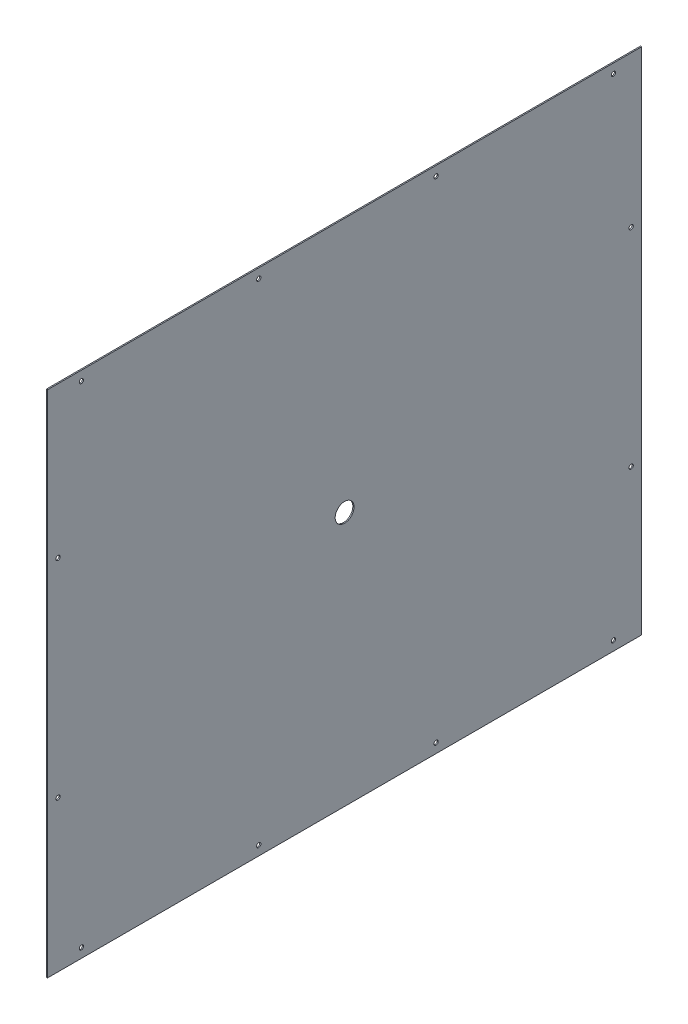
ISO-10303-21;
HEADER;
FILE_DESCRIPTION(('STEP AP214'),'2;1');
FILE_NAME('part.step','',(''),(''),'','','');
FILE_SCHEMA(('AUTOMOTIVE_DESIGN { 1 0 10303 214 1 1 1 1 }'));
ENDSEC;
DATA;
#1=APPLICATION_CONTEXT('core data for automotive mechanical design processes');
#2=APPLICATION_PROTOCOL_DEFINITION('international standard','automotive_design',2000,#1);
#3=PRODUCT_CONTEXT('',#1,'mechanical');
#4=PRODUCT('Part','Part','',(#3));
#5=PRODUCT_RELATED_PRODUCT_CATEGORY('part','',(#4));
#6=PRODUCT_DEFINITION_FORMATION('','',#4);
#7=PRODUCT_DEFINITION_CONTEXT('part definition',#1,'design');
#8=PRODUCT_DEFINITION('design','',#6,#7);
#9=PRODUCT_DEFINITION_SHAPE('','',#8);
#10=(LENGTH_UNIT() NAMED_UNIT(*) SI_UNIT(.MILLI.,.METRE.));
#11=(NAMED_UNIT(*) PLANE_ANGLE_UNIT() SI_UNIT($,.RADIAN.));
#12=(NAMED_UNIT(*) SI_UNIT($,.STERADIAN.) SOLID_ANGLE_UNIT());
#13=UNCERTAINTY_MEASURE_WITH_UNIT(LENGTH_MEASURE(1.E-05),#10,'distance_accuracy_value','');
#14=(GEOMETRIC_REPRESENTATION_CONTEXT(3) GLOBAL_UNCERTAINTY_ASSIGNED_CONTEXT((#13)) GLOBAL_UNIT_ASSIGNED_CONTEXT((#10,
#11,#12)) REPRESENTATION_CONTEXT('',''));
#15=CARTESIAN_POINT('',(0.,0.,0.));
#16=DIRECTION('',(0.,0.,1.));
#17=DIRECTION('',(1.,0.,0.));
#18=AXIS2_PLACEMENT_3D('',#15,#16,#17);
#19=CARTESIAN_POINT('',(1.5875,0.,-800.0987046));
#20=DIRECTION('',(0.,-1.,0.));
#21=DIRECTION('',(0.,0.,-1.));
#22=AXIS2_PLACEMENT_3D('',#19,#20,#21);
#23=PLANE('',#22);
#24=DIRECTION('',(0.,0.,1.));
#25=VECTOR('',#24,1.);
#26=CARTESIAN_POINT('',(0.,0.,-800.0987046));
#27=LINE('',#26,#25);
#28=CARTESIAN_POINT('',(0.,0.,-800.0987046));
#29=VERTEX_POINT('',#28);
#30=CARTESIAN_POINT('',(0.,0.,0.));
#31=VERTEX_POINT('',#30);
#32=EDGE_CURVE('E104',#29,#31,#27,.T.);
#33=ORIENTED_EDGE('',*,*,#32,.T.);
#34=DIRECTION('',(-1.,0.,0.));
#35=VECTOR('',#34,1.);
#36=CARTESIAN_POINT('',(1.5875,0.,0.));
#37=LINE('',#36,#35);
#38=CARTESIAN_POINT('',(1.5875,0.,0.));
#39=VERTEX_POINT('',#38);
#40=EDGE_CURVE('E95',#39,#31,#37,.T.);
#41=ORIENTED_EDGE('',*,*,#40,.F.);
#42=DIRECTION('',(0.,0.,1.));
#43=VECTOR('',#42,1.);
#44=CARTESIAN_POINT('',(1.5875,0.,-800.0987046));
#45=LINE('',#44,#43);
#46=CARTESIAN_POINT('',(1.5875,0.,-800.0987046));
#47=VERTEX_POINT('',#46);
#48=EDGE_CURVE('E89',#47,#39,#45,.T.);
#49=ORIENTED_EDGE('',*,*,#48,.F.);
#50=DIRECTION('',(-1.,0.,0.));
#51=VECTOR('',#50,1.);
#52=CARTESIAN_POINT('',(1.5875,0.,-800.0987046));
#53=LINE('',#52,#51);
#54=EDGE_CURVE('E100',#47,#29,#53,.T.);
#55=ORIENTED_EDGE('',*,*,#54,.T.);
#56=EDGE_LOOP('',(#33,#41,#49,#55));
#57=FACE_BOUND('',#56,.T.);
#58=ADVANCED_FACE('F35',(#57),#23,.F.);
#59=CARTESIAN_POINT('',(1.5875,0.,0.));
#60=DIRECTION('',(0.,0.,-1.));
#61=DIRECTION('',(-1.,0.,0.));
#62=AXIS2_PLACEMENT_3D('',#59,#60,#61);
#63=PLANE('',#62);
#64=DIRECTION('',(0.,-1.,0.));
#65=VECTOR('',#64,1.);
#66=CARTESIAN_POINT('',(0.,0.,0.));
#67=LINE('',#66,#65);
#68=CARTESIAN_POINT('',(0.,-685.8,0.));
#69=VERTEX_POINT('',#68);
#70=EDGE_CURVE('E94',#31,#69,#67,.T.);
#71=ORIENTED_EDGE('',*,*,#70,.T.);
#72=DIRECTION('',(-1.,0.,0.));
#73=VECTOR('',#72,1.);
#74=CARTESIAN_POINT('',(1.5875,-685.8,0.));
#75=LINE('',#74,#73);
#76=CARTESIAN_POINT('',(1.5875,-685.8,0.));
#77=VERTEX_POINT('',#76);
#78=EDGE_CURVE('E92',#77,#69,#75,.T.);
#79=ORIENTED_EDGE('',*,*,#78,.F.);
#80=DIRECTION('',(0.,-1.,0.));
#81=VECTOR('',#80,1.);
#82=CARTESIAN_POINT('',(1.5875,0.,0.));
#83=LINE('',#82,#81);
#84=EDGE_CURVE('E83',#39,#77,#83,.T.);
#85=ORIENTED_EDGE('',*,*,#84,.F.);
#86=ORIENTED_EDGE('',*,*,#40,.T.);
#87=EDGE_LOOP('',(#71,#79,#85,#86));
#88=FACE_BOUND('',#87,.T.);
#89=ADVANCED_FACE('F93',(#88),#63,.F.);
#90=CARTESIAN_POINT('',(1.5875,-685.8,-800.0987046));
#91=DIRECTION('',(0.,1.,0.));
#92=DIRECTION('',(0.,0.,1.));
#93=AXIS2_PLACEMENT_3D('',#90,#91,#92);
#94=PLANE('',#93);
#95=DIRECTION('',(0.,0.,-1.));
#96=VECTOR('',#95,1.);
#97=CARTESIAN_POINT('',(0.,-685.8,-800.0987046));
#98=LINE('',#97,#96);
#99=CARTESIAN_POINT('',(0.,-685.8,-800.0987046));
#100=VERTEX_POINT('',#99);
#101=EDGE_CURVE('E69',#69,#100,#98,.T.);
#102=ORIENTED_EDGE('',*,*,#101,.T.);
#103=DIRECTION('',(-1.,0.,0.));
#104=VECTOR('',#103,1.);
#105=CARTESIAN_POINT('',(1.5875,-685.8,-800.0987046));
#106=LINE('',#105,#104);
#107=CARTESIAN_POINT('',(1.5875,-685.8,-800.0987046));
#108=VERTEX_POINT('',#107);
#109=EDGE_CURVE('E96',#108,#100,#106,.T.);
#110=ORIENTED_EDGE('',*,*,#109,.F.);
#111=DIRECTION('',(0.,0.,-1.));
#112=VECTOR('',#111,1.);
#113=CARTESIAN_POINT('',(1.5875,-685.8,-800.0987046));
#114=LINE('',#113,#112);
#115=EDGE_CURVE('E87',#77,#108,#114,.T.);
#116=ORIENTED_EDGE('',*,*,#115,.F.);
#117=ORIENTED_EDGE('',*,*,#78,.T.);
#118=EDGE_LOOP('',(#102,#110,#116,#117));
#119=FACE_BOUND('',#118,.T.);
#120=ADVANCED_FACE('F98',(#119),#94,.F.);
#121=CARTESIAN_POINT('',(1.5875,0.,-800.0987046));
#122=DIRECTION('',(0.,0.,1.));
#123=DIRECTION('',(1.,0.,0.));
#124=AXIS2_PLACEMENT_3D('',#121,#122,#123);
#125=PLANE('',#124);
#126=DIRECTION('',(0.,1.,0.));
#127=VECTOR('',#126,1.);
#128=CARTESIAN_POINT('',(0.,0.,-800.0987046));
#129=LINE('',#128,#127);
#130=EDGE_CURVE('E75',#100,#29,#129,.T.);
#131=ORIENTED_EDGE('',*,*,#130,.T.);
#132=ORIENTED_EDGE('',*,*,#54,.F.);
#133=DIRECTION('',(0.,1.,0.));
#134=VECTOR('',#133,1.);
#135=CARTESIAN_POINT('',(1.5875,0.,-800.0987046));
#136=LINE('',#135,#134);
#137=EDGE_CURVE('E52',#108,#47,#136,.T.);
#138=ORIENTED_EDGE('',*,*,#137,.F.);
#139=ORIENTED_EDGE('',*,*,#109,.T.);
#140=EDGE_LOOP('',(#131,#132,#138,#139));
#141=FACE_BOUND('',#140,.T.);
#142=ADVANCED_FACE('F143',(#141),#125,.F.);
#143=CARTESIAN_POINT('',(1.5875,0.,0.));
#144=DIRECTION('',(1.,0.,0.));
#145=DIRECTION('',(0.,0.,-1.));
#146=AXIS2_PLACEMENT_3D('',#143,#144,#145);
#147=PLANE('',#146);
#148=CARTESIAN_POINT('',(1.5875,-342.9,-400.0493523));
#149=DIRECTION('',(-1.,0.,0.));
#150=DIRECTION('',(0.,0.,1.));
#151=AXIS2_PLACEMENT_3D('',#148,#149,#150);
#152=CIRCLE('',#151,12.7);
#153=CARTESIAN_POINT('',(1.5875,-342.9,-387.3493523));
#154=VERTEX_POINT('',#153);
#155=EDGE_CURVE('E256',#154,#154,#152,.T.);
#156=ORIENTED_EDGE('',*,*,#155,.T.);
#157=EDGE_LOOP('',(#156));
#158=FACE_BOUND('',#157,.T.);
#159=CARTESIAN_POINT('',(1.5875,-203.2,-785.8118396));
#160=DIRECTION('',(1.,0.,0.));
#161=DIRECTION('',(0.,0.,-1.));
#162=AXIS2_PLACEMENT_3D('',#159,#160,#161);
#163=CIRCLE('',#162,2.89999999999999);
#164=CARTESIAN_POINT('',(1.5875,-203.2,-788.7118396));
#165=VERTEX_POINT('',#164);
#166=EDGE_CURVE('E253',#165,#165,#163,.T.);
#167=ORIENTED_EDGE('',*,*,#166,.F.);
#168=EDGE_LOOP('',(#167));
#169=FACE_BOUND('',#168,.T.);
#170=CARTESIAN_POINT('',(1.5875,-482.6,-785.8118396));
#171=DIRECTION('',(1.,0.,0.));
#172=DIRECTION('',(0.,0.,-1.));
#173=AXIS2_PLACEMENT_3D('',#170,#171,#172);
#174=CIRCLE('',#173,2.90000000000001);
#175=CARTESIAN_POINT('',(1.5875,-482.6,-788.7118396));
#176=VERTEX_POINT('',#175);
#177=EDGE_CURVE('E247',#176,#176,#174,.T.);
#178=ORIENTED_EDGE('',*,*,#177,.F.);
#179=EDGE_LOOP('',(#178));
#180=FACE_BOUND('',#179,.T.);
#181=CARTESIAN_POINT('',(1.5875,-482.6,-14.286865));
#182=DIRECTION('',(1.,0.,0.));
#183=DIRECTION('',(0.,0.,-1.));
#184=AXIS2_PLACEMENT_3D('',#181,#182,#183);
#185=CIRCLE('',#184,2.90000000000001);
#186=CARTESIAN_POINT('',(1.5875,-482.6,-17.186865));
#187=VERTEX_POINT('',#186);
#188=EDGE_CURVE('E241',#187,#187,#185,.T.);
#189=ORIENTED_EDGE('',*,*,#188,.F.);
#190=EDGE_LOOP('',(#189));
#191=FACE_BOUND('',#190,.T.);
#192=CARTESIAN_POINT('',(1.5875,-203.2,-14.286865));
#193=DIRECTION('',(1.,0.,0.));
#194=DIRECTION('',(0.,0.,-1.));
#195=AXIS2_PLACEMENT_3D('',#192,#193,#194);
#196=CIRCLE('',#195,2.89999999999999);
#197=CARTESIAN_POINT('',(1.5875,-203.2,-17.186865));
#198=VERTEX_POINT('',#197);
#199=EDGE_CURVE('E235',#198,#198,#196,.T.);
#200=ORIENTED_EDGE('',*,*,#199,.F.);
#201=EDGE_LOOP('',(#200));
#202=FACE_BOUND('',#201,.T.);
#203=CARTESIAN_POINT('',(1.5875,-673.1,-523.2387046));
#204=DIRECTION('',(1.,0.,0.));
#205=DIRECTION('',(0.,0.,-1.));
#206=AXIS2_PLACEMENT_3D('',#203,#204,#205);
#207=CIRCLE('',#206,2.90000000000001);
#208=CARTESIAN_POINT('',(1.5875,-673.1,-526.1387046));
#209=VERTEX_POINT('',#208);
#210=EDGE_CURVE('E226',#209,#209,#207,.T.);
#211=ORIENTED_EDGE('',*,*,#210,.F.);
#212=EDGE_LOOP('',(#211));
#213=FACE_BOUND('',#212,.T.);
#214=CARTESIAN_POINT('',(1.5875,-12.7,-523.2387046));
#215=DIRECTION('',(1.,0.,0.));
#216=DIRECTION('',(0.,0.,-1.));
#217=AXIS2_PLACEMENT_3D('',#214,#215,#216);
#218=CIRCLE('',#217,2.89999999999999);
#219=CARTESIAN_POINT('',(1.5875,-12.7,-526.1387046));
#220=VERTEX_POINT('',#219);
#221=EDGE_CURVE('E220',#220,#220,#218,.T.);
#222=ORIENTED_EDGE('',*,*,#221,.F.);
#223=EDGE_LOOP('',(#222));
#224=FACE_BOUND('',#223,.T.);
#225=CARTESIAN_POINT('',(1.5875,-12.7,-761.9987046));
#226=DIRECTION('',(1.,0.,0.));
#227=DIRECTION('',(0.,0.,-1.));
#228=AXIS2_PLACEMENT_3D('',#225,#226,#227);
#229=CIRCLE('',#228,2.89999999999999);
#230=CARTESIAN_POINT('',(1.5875,-12.7,-764.8987046));
#231=VERTEX_POINT('',#230);
#232=EDGE_CURVE('E215',#231,#231,#229,.T.);
#233=ORIENTED_EDGE('',*,*,#232,.F.);
#234=EDGE_LOOP('',(#233));
#235=FACE_BOUND('',#234,.T.);
#236=CARTESIAN_POINT('',(1.5875,-673.1,-761.9987046));
#237=DIRECTION('',(1.,0.,0.));
#238=DIRECTION('',(0.,0.,-1.));
#239=AXIS2_PLACEMENT_3D('',#236,#237,#238);
#240=CIRCLE('',#239,2.90000000000001);
#241=CARTESIAN_POINT('',(1.5875,-673.1,-764.8987046));
#242=VERTEX_POINT('',#241);
#243=EDGE_CURVE('E209',#242,#242,#240,.T.);
#244=ORIENTED_EDGE('',*,*,#243,.F.);
#245=EDGE_LOOP('',(#244));
#246=FACE_BOUND('',#245,.T.);
#247=ORIENTED_EDGE('',*,*,#48,.T.);
#248=ORIENTED_EDGE('',*,*,#84,.T.);
#249=ORIENTED_EDGE('',*,*,#115,.T.);
#250=ORIENTED_EDGE('',*,*,#137,.T.);
#251=EDGE_LOOP('',(#247,#248,#249,#250));
#252=FACE_BOUND('',#251,.T.);
#253=CARTESIAN_POINT('',(1.5875,-12.7,-284.478704599999));
#254=DIRECTION('',(1.,0.,0.));
#255=DIRECTION('',(0.,0.,-1.));
#256=AXIS2_PLACEMENT_3D('',#253,#254,#255);
#257=CIRCLE('',#256,2.89999999999999);
#258=CARTESIAN_POINT('',(1.5875,-12.7,-287.378704599999));
#259=VERTEX_POINT('',#258);
#260=EDGE_CURVE('E117',#259,#259,#257,.T.);
#261=ORIENTED_EDGE('',*,*,#260,.F.);
#262=EDGE_LOOP('',(#261));
#263=FACE_BOUND('',#262,.T.);
#264=CARTESIAN_POINT('',(1.5875,-12.7,-45.7187045999993));
#265=DIRECTION('',(1.,0.,0.));
#266=DIRECTION('',(0.,0.,-1.));
#267=AXIS2_PLACEMENT_3D('',#264,#265,#266);
#268=CIRCLE('',#267,2.89999999999999);
#269=CARTESIAN_POINT('',(1.5875,-12.7,-48.6187045999993));
#270=VERTEX_POINT('',#269);
#271=EDGE_CURVE('E123',#270,#270,#268,.T.);
#272=ORIENTED_EDGE('',*,*,#271,.F.);
#273=EDGE_LOOP('',(#272));
#274=FACE_BOUND('',#273,.T.);
#275=CARTESIAN_POINT('',(1.5875,-673.1,-284.478704599999));
#276=DIRECTION('',(1.,0.,0.));
#277=DIRECTION('',(0.,0.,-1.));
#278=AXIS2_PLACEMENT_3D('',#275,#276,#277);
#279=CIRCLE('',#278,2.90000000000001);
#280=CARTESIAN_POINT('',(1.5875,-673.1,-287.378704599999));
#281=VERTEX_POINT('',#280);
#282=EDGE_CURVE('E129',#281,#281,#279,.T.);
#283=ORIENTED_EDGE('',*,*,#282,.F.);
#284=EDGE_LOOP('',(#283));
#285=FACE_BOUND('',#284,.T.);
#286=CARTESIAN_POINT('',(1.5875,-673.1,-45.7187045999993));
#287=DIRECTION('',(1.,0.,0.));
#288=DIRECTION('',(0.,0.,-1.));
#289=AXIS2_PLACEMENT_3D('',#286,#287,#288);
#290=CIRCLE('',#289,2.90000000000001);
#291=CARTESIAN_POINT('',(1.5875,-673.1,-48.6187045999993));
#292=VERTEX_POINT('',#291);
#293=EDGE_CURVE('E11',#292,#292,#290,.T.);
#294=ORIENTED_EDGE('',*,*,#293,.F.);
#295=EDGE_LOOP('',(#294));
#296=FACE_BOUND('',#295,.T.);
#297=ADVANCED_FACE('F84',(#158,#169,#180,#191,#202,#213,#224,#235,#246,#252,#263,#274,#285,
#296),#147,.T.);
#298=CARTESIAN_POINT('',(0.,0.,0.));
#299=DIRECTION('',(1.,0.,0.));
#300=DIRECTION('',(0.,0.,-1.));
#301=AXIS2_PLACEMENT_3D('',#298,#299,#300);
#302=PLANE('',#301);
#303=CARTESIAN_POINT('',(0.,-342.9,-400.0493523));
#304=DIRECTION('',(-1.,0.,0.));
#305=DIRECTION('',(0.,0.,1.));
#306=AXIS2_PLACEMENT_3D('',#303,#304,#305);
#307=CIRCLE('',#306,12.7);
#308=CARTESIAN_POINT('',(0.,-342.9,-387.3493523));
#309=VERTEX_POINT('',#308);
#310=EDGE_CURVE('E257',#309,#309,#307,.T.);
#311=ORIENTED_EDGE('',*,*,#310,.F.);
#312=EDGE_LOOP('',(#311));
#313=FACE_BOUND('',#312,.T.);
#314=CARTESIAN_POINT('',(0.,-203.2,-785.8118396));
#315=DIRECTION('',(1.,0.,0.));
#316=DIRECTION('',(0.,0.,-1.));
#317=AXIS2_PLACEMENT_3D('',#314,#315,#316);
#318=CIRCLE('',#317,2.89999999999999);
#319=CARTESIAN_POINT('',(0.,-203.2,-788.7118396));
#320=VERTEX_POINT('',#319);
#321=EDGE_CURVE('E250',#320,#320,#318,.T.);
#322=ORIENTED_EDGE('',*,*,#321,.T.);
#323=EDGE_LOOP('',(#322));
#324=FACE_BOUND('',#323,.T.);
#325=CARTESIAN_POINT('',(0.,-482.6,-785.8118396));
#326=DIRECTION('',(1.,0.,0.));
#327=DIRECTION('',(0.,0.,-1.));
#328=AXIS2_PLACEMENT_3D('',#325,#326,#327);
#329=CIRCLE('',#328,2.90000000000001);
#330=CARTESIAN_POINT('',(0.,-482.6,-788.7118396));
#331=VERTEX_POINT('',#330);
#332=EDGE_CURVE('E244',#331,#331,#329,.T.);
#333=ORIENTED_EDGE('',*,*,#332,.T.);
#334=EDGE_LOOP('',(#333));
#335=FACE_BOUND('',#334,.T.);
#336=CARTESIAN_POINT('',(0.,-482.6,-14.286865));
#337=DIRECTION('',(1.,0.,0.));
#338=DIRECTION('',(0.,0.,-1.));
#339=AXIS2_PLACEMENT_3D('',#336,#337,#338);
#340=CIRCLE('',#339,2.90000000000001);
#341=CARTESIAN_POINT('',(0.,-482.6,-17.186865));
#342=VERTEX_POINT('',#341);
#343=EDGE_CURVE('E238',#342,#342,#340,.T.);
#344=ORIENTED_EDGE('',*,*,#343,.T.);
#345=EDGE_LOOP('',(#344));
#346=FACE_BOUND('',#345,.T.);
#347=CARTESIAN_POINT('',(0.,-203.2,-14.286865));
#348=DIRECTION('',(1.,0.,0.));
#349=DIRECTION('',(0.,0.,-1.));
#350=AXIS2_PLACEMENT_3D('',#347,#348,#349);
#351=CIRCLE('',#350,2.89999999999999);
#352=CARTESIAN_POINT('',(0.,-203.2,-17.186865));
#353=VERTEX_POINT('',#352);
#354=EDGE_CURVE('E232',#353,#353,#351,.T.);
#355=ORIENTED_EDGE('',*,*,#354,.T.);
#356=EDGE_LOOP('',(#355));
#357=FACE_BOUND('',#356,.T.);
#358=CARTESIAN_POINT('',(0.,-673.1,-523.2387046));
#359=DIRECTION('',(1.,0.,0.));
#360=DIRECTION('',(0.,0.,-1.));
#361=AXIS2_PLACEMENT_3D('',#358,#359,#360);
#362=CIRCLE('',#361,2.90000000000001);
#363=CARTESIAN_POINT('',(0.,-673.1,-526.1387046));
#364=VERTEX_POINT('',#363);
#365=EDGE_CURVE('E229',#364,#364,#362,.T.);
#366=ORIENTED_EDGE('',*,*,#365,.T.);
#367=EDGE_LOOP('',(#366));
#368=FACE_BOUND('',#367,.T.);
#369=CARTESIAN_POINT('',(0.,-12.7,-523.2387046));
#370=DIRECTION('',(1.,0.,0.));
#371=DIRECTION('',(0.,0.,-1.));
#372=AXIS2_PLACEMENT_3D('',#369,#370,#371);
#373=CIRCLE('',#372,2.9);
#374=CARTESIAN_POINT('',(0.,-12.7,-526.1387046));
#375=VERTEX_POINT('',#374);
#376=EDGE_CURVE('E223',#375,#375,#373,.T.);
#377=ORIENTED_EDGE('',*,*,#376,.T.);
#378=EDGE_LOOP('',(#377));
#379=FACE_BOUND('',#378,.T.);
#380=CARTESIAN_POINT('',(0.,-12.7,-761.9987046));
#381=DIRECTION('',(1.,0.,0.));
#382=DIRECTION('',(0.,0.,-1.));
#383=AXIS2_PLACEMENT_3D('',#380,#381,#382);
#384=CIRCLE('',#383,2.9);
#385=CARTESIAN_POINT('',(0.,-12.7,-764.8987046));
#386=VERTEX_POINT('',#385);
#387=EDGE_CURVE('E211',#386,#386,#384,.T.);
#388=ORIENTED_EDGE('',*,*,#387,.T.);
#389=EDGE_LOOP('',(#388));
#390=FACE_BOUND('',#389,.T.);
#391=CARTESIAN_POINT('',(0.,-673.1,-761.9987046));
#392=DIRECTION('',(1.,0.,0.));
#393=DIRECTION('',(0.,0.,-1.));
#394=AXIS2_PLACEMENT_3D('',#391,#392,#393);
#395=CIRCLE('',#394,2.90000000000001);
#396=CARTESIAN_POINT('',(0.,-673.1,-764.8987046));
#397=VERTEX_POINT('',#396);
#398=EDGE_CURVE('E107',#397,#397,#395,.T.);
#399=ORIENTED_EDGE('',*,*,#398,.T.);
#400=EDGE_LOOP('',(#399));
#401=FACE_BOUND('',#400,.T.);
#402=ORIENTED_EDGE('',*,*,#32,.F.);
#403=ORIENTED_EDGE('',*,*,#130,.F.);
#404=ORIENTED_EDGE('',*,*,#101,.F.);
#405=ORIENTED_EDGE('',*,*,#70,.F.);
#406=EDGE_LOOP('',(#402,#403,#404,#405));
#407=FACE_BOUND('',#406,.T.);
#408=CARTESIAN_POINT('',(0.,-12.7,-284.478704599999));
#409=DIRECTION('',(1.,0.,0.));
#410=DIRECTION('',(0.,0.,-1.));
#411=AXIS2_PLACEMENT_3D('',#408,#409,#410);
#412=CIRCLE('',#411,2.9);
#413=CARTESIAN_POINT('',(0.,-12.7,-287.378704599999));
#414=VERTEX_POINT('',#413);
#415=EDGE_CURVE('E114',#414,#414,#412,.T.);
#416=ORIENTED_EDGE('',*,*,#415,.T.);
#417=EDGE_LOOP('',(#416));
#418=FACE_BOUND('',#417,.T.);
#419=CARTESIAN_POINT('',(0.,-12.7,-45.7187045999993));
#420=DIRECTION('',(1.,0.,0.));
#421=DIRECTION('',(0.,0.,-1.));
#422=AXIS2_PLACEMENT_3D('',#419,#420,#421);
#423=CIRCLE('',#422,2.9);
#424=CARTESIAN_POINT('',(0.,-12.7,-48.6187045999993));
#425=VERTEX_POINT('',#424);
#426=EDGE_CURVE('E120',#425,#425,#423,.T.);
#427=ORIENTED_EDGE('',*,*,#426,.T.);
#428=EDGE_LOOP('',(#427));
#429=FACE_BOUND('',#428,.T.);
#430=CARTESIAN_POINT('',(0.,-673.1,-284.478704599999));
#431=DIRECTION('',(1.,0.,0.));
#432=DIRECTION('',(0.,0.,-1.));
#433=AXIS2_PLACEMENT_3D('',#430,#431,#432);
#434=CIRCLE('',#433,2.90000000000001);
#435=CARTESIAN_POINT('',(0.,-673.1,-287.378704599999));
#436=VERTEX_POINT('',#435);
#437=EDGE_CURVE('E126',#436,#436,#434,.T.);
#438=ORIENTED_EDGE('',*,*,#437,.T.);
#439=EDGE_LOOP('',(#438));
#440=FACE_BOUND('',#439,.T.);
#441=CARTESIAN_POINT('',(0.,-673.1,-45.7187045999993));
#442=DIRECTION('',(1.,0.,0.));
#443=DIRECTION('',(0.,0.,-1.));
#444=AXIS2_PLACEMENT_3D('',#441,#442,#443);
#445=CIRCLE('',#444,2.90000000000001);
#446=CARTESIAN_POINT('',(0.,-673.1,-48.6187045999993));
#447=VERTEX_POINT('',#446);
#448=EDGE_CURVE('E44',#447,#447,#445,.T.);
#449=ORIENTED_EDGE('',*,*,#448,.T.);
#450=EDGE_LOOP('',(#449));
#451=FACE_BOUND('',#450,.T.);
#452=ADVANCED_FACE('F134',(#313,#324,#335,#346,#357,#368,#379,#390,#401,#407,#418,#429,#440,
#451),#302,.F.);
#453=CARTESIAN_POINT('',(1.5875,-673.1,-761.9987046));
#454=DIRECTION('',(1.,0.,0.));
#455=DIRECTION('',(0.,0.,-1.));
#456=AXIS2_PLACEMENT_3D('',#453,#454,#455);
#457=CYLINDRICAL_SURFACE('',#456,2.90000000000001);
#458=ORIENTED_EDGE('',*,*,#398,.F.);
#459=EDGE_LOOP('',(#458));
#460=FACE_BOUND('',#459,.T.);
#461=ORIENTED_EDGE('',*,*,#243,.T.);
#462=EDGE_LOOP('',(#461));
#463=FACE_BOUND('',#462,.T.);
#464=ADVANCED_FACE('F150',(#460,#463),#457,.F.);
#465=CARTESIAN_POINT('',(1.5875,-12.7,-761.9987046));
#466=DIRECTION('',(1.,0.,0.));
#467=DIRECTION('',(0.,0.,-1.));
#468=AXIS2_PLACEMENT_3D('',#465,#466,#467);
#469=CYLINDRICAL_SURFACE('',#468,2.89999999999999);
#470=ORIENTED_EDGE('',*,*,#387,.F.);
#471=EDGE_LOOP('',(#470));
#472=FACE_BOUND('',#471,.T.);
#473=ORIENTED_EDGE('',*,*,#232,.T.);
#474=EDGE_LOOP('',(#473));
#475=FACE_BOUND('',#474,.T.);
#476=ADVANCED_FACE('F196',(#472,#475),#469,.F.);
#477=CARTESIAN_POINT('',(1.5875,-12.7,-523.2387046));
#478=DIRECTION('',(1.,0.,0.));
#479=DIRECTION('',(0.,0.,-1.));
#480=AXIS2_PLACEMENT_3D('',#477,#478,#479);
#481=CYLINDRICAL_SURFACE('',#480,2.89999999999999);
#482=ORIENTED_EDGE('',*,*,#376,.F.);
#483=EDGE_LOOP('',(#482));
#484=FACE_BOUND('',#483,.T.);
#485=ORIENTED_EDGE('',*,*,#221,.T.);
#486=EDGE_LOOP('',(#485));
#487=FACE_BOUND('',#486,.T.);
#488=ADVANCED_FACE('F170',(#484,#487),#481,.F.);
#489=CARTESIAN_POINT('',(1.5875,-12.7,-284.478704599999));
#490=DIRECTION('',(1.,0.,0.));
#491=DIRECTION('',(0.,0.,-1.));
#492=AXIS2_PLACEMENT_3D('',#489,#490,#491);
#493=CYLINDRICAL_SURFACE('',#492,2.89999999999999);
#494=ORIENTED_EDGE('',*,*,#415,.F.);
#495=EDGE_LOOP('',(#494));
#496=FACE_BOUND('',#495,.T.);
#497=ORIENTED_EDGE('',*,*,#260,.T.);
#498=EDGE_LOOP('',(#497));
#499=FACE_BOUND('',#498,.T.);
#500=ADVANCED_FACE('F166',(#496,#499),#493,.F.);
#501=CARTESIAN_POINT('',(1.5875,-12.7,-45.7187045999993));
#502=DIRECTION('',(1.,0.,0.));
#503=DIRECTION('',(0.,0.,-1.));
#504=AXIS2_PLACEMENT_3D('',#501,#502,#503);
#505=CYLINDRICAL_SURFACE('',#504,2.89999999999999);
#506=ORIENTED_EDGE('',*,*,#426,.F.);
#507=EDGE_LOOP('',(#506));
#508=FACE_BOUND('',#507,.T.);
#509=ORIENTED_EDGE('',*,*,#271,.T.);
#510=EDGE_LOOP('',(#509));
#511=FACE_BOUND('',#510,.T.);
#512=ADVANCED_FACE('F169',(#508,#511),#505,.F.);
#513=CARTESIAN_POINT('',(1.5875,-673.1,-523.2387046));
#514=DIRECTION('',(1.,0.,0.));
#515=DIRECTION('',(0.,0.,-1.));
#516=AXIS2_PLACEMENT_3D('',#513,#514,#515);
#517=CYLINDRICAL_SURFACE('',#516,2.90000000000001);
#518=ORIENTED_EDGE('',*,*,#365,.F.);
#519=EDGE_LOOP('',(#518));
#520=FACE_BOUND('',#519,.T.);
#521=ORIENTED_EDGE('',*,*,#210,.T.);
#522=EDGE_LOOP('',(#521));
#523=FACE_BOUND('',#522,.T.);
#524=ADVANCED_FACE('F173',(#520,#523),#517,.F.);
#525=CARTESIAN_POINT('',(1.5875,-673.1,-284.478704599999));
#526=DIRECTION('',(1.,0.,0.));
#527=DIRECTION('',(0.,0.,-1.));
#528=AXIS2_PLACEMENT_3D('',#525,#526,#527);
#529=CYLINDRICAL_SURFACE('',#528,2.90000000000001);
#530=ORIENTED_EDGE('',*,*,#437,.F.);
#531=EDGE_LOOP('',(#530));
#532=FACE_BOUND('',#531,.T.);
#533=ORIENTED_EDGE('',*,*,#282,.T.);
#534=EDGE_LOOP('',(#533));
#535=FACE_BOUND('',#534,.T.);
#536=ADVANCED_FACE('F139',(#532,#535),#529,.F.);
#537=CARTESIAN_POINT('',(1.5875,-673.1,-45.7187045999993));
#538=DIRECTION('',(1.,0.,0.));
#539=DIRECTION('',(0.,0.,-1.));
#540=AXIS2_PLACEMENT_3D('',#537,#538,#539);
#541=CYLINDRICAL_SURFACE('',#540,2.90000000000001);
#542=ORIENTED_EDGE('',*,*,#448,.F.);
#543=EDGE_LOOP('',(#542));
#544=FACE_BOUND('',#543,.T.);
#545=ORIENTED_EDGE('',*,*,#293,.T.);
#546=EDGE_LOOP('',(#545));
#547=FACE_BOUND('',#546,.T.);
#548=ADVANCED_FACE('F37',(#544,#547),#541,.F.);
#549=CARTESIAN_POINT('',(1.5875,-203.2,-14.286865));
#550=DIRECTION('',(1.,0.,0.));
#551=DIRECTION('',(0.,0.,-1.));
#552=AXIS2_PLACEMENT_3D('',#549,#550,#551);
#553=CYLINDRICAL_SURFACE('',#552,2.89999999999999);
#554=ORIENTED_EDGE('',*,*,#354,.F.);
#555=EDGE_LOOP('',(#554));
#556=FACE_BOUND('',#555,.T.);
#557=ORIENTED_EDGE('',*,*,#199,.T.);
#558=EDGE_LOOP('',(#557));
#559=FACE_BOUND('',#558,.T.);
#560=ADVANCED_FACE('F138',(#556,#559),#553,.F.);
#561=CARTESIAN_POINT('',(1.5875,-482.6,-14.286865));
#562=DIRECTION('',(1.,0.,0.));
#563=DIRECTION('',(0.,0.,-1.));
#564=AXIS2_PLACEMENT_3D('',#561,#562,#563);
#565=CYLINDRICAL_SURFACE('',#564,2.90000000000001);
#566=ORIENTED_EDGE('',*,*,#343,.F.);
#567=EDGE_LOOP('',(#566));
#568=FACE_BOUND('',#567,.T.);
#569=ORIENTED_EDGE('',*,*,#188,.T.);
#570=EDGE_LOOP('',(#569));
#571=FACE_BOUND('',#570,.T.);
#572=ADVANCED_FACE('F302',(#568,#571),#565,.F.);
#573=CARTESIAN_POINT('',(1.5875,-482.6,-785.8118396));
#574=DIRECTION('',(1.,0.,0.));
#575=DIRECTION('',(0.,0.,-1.));
#576=AXIS2_PLACEMENT_3D('',#573,#574,#575);
#577=CYLINDRICAL_SURFACE('',#576,2.90000000000001);
#578=ORIENTED_EDGE('',*,*,#332,.F.);
#579=EDGE_LOOP('',(#578));
#580=FACE_BOUND('',#579,.T.);
#581=ORIENTED_EDGE('',*,*,#177,.T.);
#582=EDGE_LOOP('',(#581));
#583=FACE_BOUND('',#582,.T.);
#584=ADVANCED_FACE('F310',(#580,#583),#577,.F.);
#585=CARTESIAN_POINT('',(1.5875,-203.2,-785.8118396));
#586=DIRECTION('',(1.,0.,0.));
#587=DIRECTION('',(0.,0.,-1.));
#588=AXIS2_PLACEMENT_3D('',#585,#586,#587);
#589=CYLINDRICAL_SURFACE('',#588,2.89999999999999);
#590=ORIENTED_EDGE('',*,*,#321,.F.);
#591=EDGE_LOOP('',(#590));
#592=FACE_BOUND('',#591,.T.);
#593=ORIENTED_EDGE('',*,*,#166,.T.);
#594=EDGE_LOOP('',(#593));
#595=FACE_BOUND('',#594,.T.);
#596=ADVANCED_FACE('F265',(#592,#595),#589,.F.);
#597=CARTESIAN_POINT('',(1.5875,-342.9,-400.0493523));
#598=DIRECTION('',(-1.,0.,0.));
#599=DIRECTION('',(0.,0.,1.));
#600=AXIS2_PLACEMENT_3D('',#597,#598,#599);
#601=CYLINDRICAL_SURFACE('',#600,12.7);
#602=ORIENTED_EDGE('',*,*,#155,.F.);
#603=EDGE_LOOP('',(#602));
#604=FACE_BOUND('',#603,.T.);
#605=ORIENTED_EDGE('',*,*,#310,.T.);
#606=EDGE_LOOP('',(#605));
#607=FACE_BOUND('',#606,.T.);
#608=ADVANCED_FACE('F262',(#604,#607),#601,.F.);
#609=CLOSED_SHELL('',(#58,#89,#120,#142,#297,#452,#464,#476,#488,#500,#512,#524,#536,#548,#560,
#572,#584,#596,#608));
#610=MANIFOLD_SOLID_BREP('B2',#609);
#611=ADVANCED_BREP_SHAPE_REPRESENTATION('',(#18,#610),#14);
#612=SHAPE_DEFINITION_REPRESENTATION(#9,#611);
ENDSEC;
END-ISO-10303-21;
